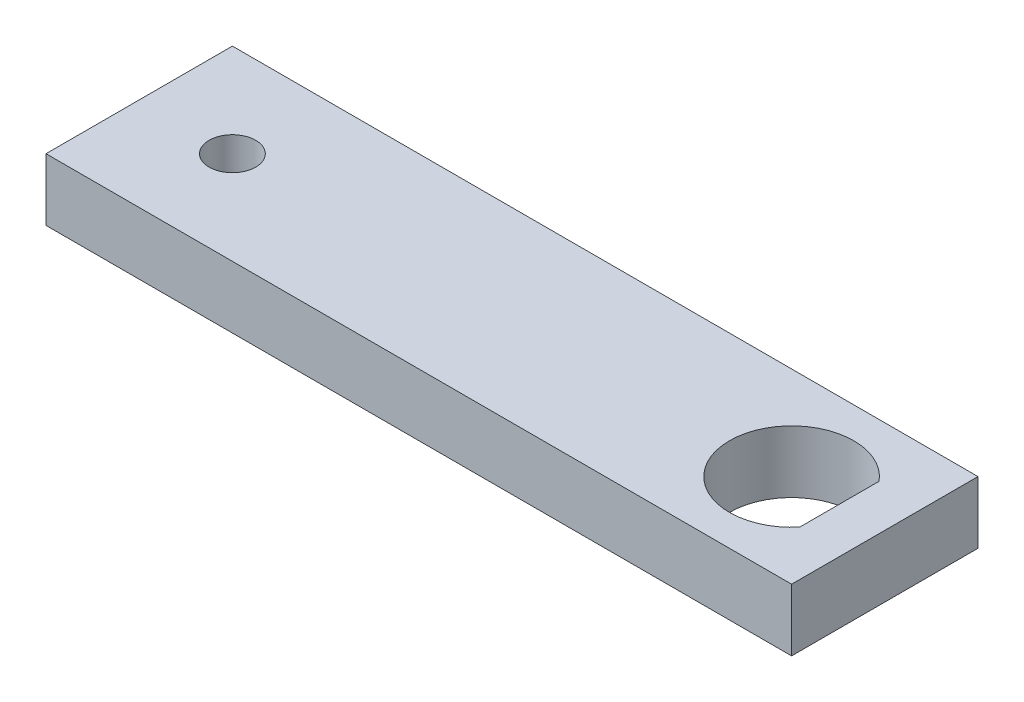
ISO-10303-21;
HEADER;
FILE_DESCRIPTION(('STEP AP214'),'2;1');
FILE_NAME('part.step','',(''),(''),'','','');
FILE_SCHEMA(('AUTOMOTIVE_DESIGN { 1 0 10303 214 1 1 1 1 }'));
ENDSEC;
DATA;
#1=APPLICATION_CONTEXT('core data for automotive mechanical design processes');
#2=APPLICATION_PROTOCOL_DEFINITION('international standard','automotive_design',2000,#1);
#3=PRODUCT_CONTEXT('',#1,'mechanical');
#4=PRODUCT('Part','Part','',(#3));
#5=PRODUCT_RELATED_PRODUCT_CATEGORY('part','',(#4));
#6=PRODUCT_DEFINITION_FORMATION('','',#4);
#7=PRODUCT_DEFINITION_CONTEXT('part definition',#1,'design');
#8=PRODUCT_DEFINITION('design','',#6,#7);
#9=PRODUCT_DEFINITION_SHAPE('','',#8);
#10=(LENGTH_UNIT() NAMED_UNIT(*) SI_UNIT(.MILLI.,.METRE.));
#11=(NAMED_UNIT(*) PLANE_ANGLE_UNIT() SI_UNIT($,.RADIAN.));
#12=(NAMED_UNIT(*) SI_UNIT($,.STERADIAN.) SOLID_ANGLE_UNIT());
#13=UNCERTAINTY_MEASURE_WITH_UNIT(LENGTH_MEASURE(1.E-05),#10,'distance_accuracy_value','');
#14=(GEOMETRIC_REPRESENTATION_CONTEXT(3) GLOBAL_UNCERTAINTY_ASSIGNED_CONTEXT((#13)) GLOBAL_UNIT_ASSIGNED_CONTEXT((#10,
#11,#12)) REPRESENTATION_CONTEXT('',''));
#15=CARTESIAN_POINT('',(0.,0.,0.));
#16=DIRECTION('',(0.,0.,1.));
#17=DIRECTION('',(1.,0.,0.));
#18=AXIS2_PLACEMENT_3D('',#15,#16,#17);
#19=CARTESIAN_POINT('',(0.,0.,19.05));
#20=DIRECTION('',(-1.,0.,0.));
#21=DIRECTION('',(0.,0.,1.));
#22=AXIS2_PLACEMENT_3D('',#19,#20,#21);
#23=PLANE('',#22);
#24=DIRECTION('',(0.,1.,0.));
#25=VECTOR('',#24,1.);
#26=CARTESIAN_POINT('',(0.,0.,0.));
#27=LINE('',#26,#25);
#28=CARTESIAN_POINT('',(0.,0.,0.));
#29=VERTEX_POINT('',#28);
#30=CARTESIAN_POINT('',(0.,6.35000000000001,0.));
#31=VERTEX_POINT('',#30);
#32=EDGE_CURVE('E112',#29,#31,#27,.T.);
#33=ORIENTED_EDGE('',*,*,#32,.F.);
#34=DIRECTION('',(0.,0.,-1.));
#35=VECTOR('',#34,1.);
#36=CARTESIAN_POINT('',(0.,0.,19.05));
#37=LINE('',#36,#35);
#38=CARTESIAN_POINT('',(0.,0.,19.05));
#39=VERTEX_POINT('',#38);
#40=EDGE_CURVE('E11',#39,#29,#37,.T.);
#41=ORIENTED_EDGE('',*,*,#40,.F.);
#42=DIRECTION('',(0.,1.,0.));
#43=VECTOR('',#42,1.);
#44=CARTESIAN_POINT('',(0.,0.,19.05));
#45=LINE('',#44,#43);
#46=CARTESIAN_POINT('',(0.,6.35000000000001,19.05));
#47=VERTEX_POINT('',#46);
#48=EDGE_CURVE('E114',#39,#47,#45,.T.);
#49=ORIENTED_EDGE('',*,*,#48,.T.);
#50=DIRECTION('',(0.,0.,-1.));
#51=VECTOR('',#50,1.);
#52=CARTESIAN_POINT('',(0.,6.35000000000001,19.05));
#53=LINE('',#52,#51);
#54=EDGE_CURVE('E42',#47,#31,#53,.T.);
#55=ORIENTED_EDGE('',*,*,#54,.T.);
#56=EDGE_LOOP('',(#33,#41,#49,#55));
#57=FACE_BOUND('',#56,.T.);
#58=ADVANCED_FACE('F39',(#57),#23,.T.);
#59=CARTESIAN_POINT('',(0.,0.,19.05));
#60=DIRECTION('',(0.,1.,0.));
#61=DIRECTION('',(-1.,0.,0.));
#62=AXIS2_PLACEMENT_3D('',#59,#60,#61);
#63=PLANE('',#62);
#64=CARTESIAN_POINT('',(9.525,0.,9.525));
#65=DIRECTION('',(0.,1.,0.));
#66=DIRECTION('',(-1.,0.,0.));
#67=AXIS2_PLACEMENT_3D('',#64,#65,#66);
#68=CIRCLE('',#67,2.38125);
#69=CARTESIAN_POINT('',(7.14375,0.,9.525));
#70=VERTEX_POINT('',#69);
#71=EDGE_CURVE('E110',#70,#70,#68,.T.);
#72=ORIENTED_EDGE('',*,*,#71,.T.);
#73=EDGE_LOOP('',(#72));
#74=FACE_BOUND('',#73,.T.);
#75=DIRECTION('',(0.,0.,1.));
#76=VECTOR('',#75,1.);
#77=CARTESIAN_POINT('',(71.5645,0.,5.47342132619889));
#78=LINE('',#77,#76);
#79=CARTESIAN_POINT('',(71.5645,0.,5.47342132619889));
#80=VERTEX_POINT('',#79);
#81=CARTESIAN_POINT('',(71.5645,0.,13.5765786738011));
#82=VERTEX_POINT('',#81);
#83=EDGE_CURVE('E91',#80,#82,#78,.T.);
#84=ORIENTED_EDGE('',*,*,#83,.F.);
#85=CARTESIAN_POINT('',(66.675,0.,9.525));
#86=DIRECTION('',(0.,1.,0.));
#87=DIRECTION('',(-1.,0.,0.));
#88=AXIS2_PLACEMENT_3D('',#85,#86,#87);
#89=CIRCLE('',#88,6.35);
#90=EDGE_CURVE('E55',#80,#82,#89,.T.);
#91=ORIENTED_EDGE('',*,*,#90,.T.);
#92=EDGE_LOOP('',(#84,#91));
#93=FACE_BOUND('',#92,.T.);
#94=DIRECTION('',(1.,0.,0.));
#95=VECTOR('',#94,1.);
#96=CARTESIAN_POINT('',(0.,0.,0.));
#97=LINE('',#96,#95);
#98=CARTESIAN_POINT('',(76.2,0.,0.));
#99=VERTEX_POINT('',#98);
#100=EDGE_CURVE('E118',#29,#99,#97,.T.);
#101=ORIENTED_EDGE('',*,*,#100,.T.);
#102=DIRECTION('',(0.,0.,-1.));
#103=VECTOR('',#102,1.);
#104=CARTESIAN_POINT('',(76.2,0.,19.05));
#105=LINE('',#104,#103);
#106=CARTESIAN_POINT('',(76.2,0.,19.05));
#107=VERTEX_POINT('',#106);
#108=EDGE_CURVE('E47',#107,#99,#105,.T.);
#109=ORIENTED_EDGE('',*,*,#108,.F.);
#110=DIRECTION('',(1.,0.,0.));
#111=VECTOR('',#110,1.);
#112=CARTESIAN_POINT('',(0.,0.,19.05));
#113=LINE('',#112,#111);
#114=EDGE_CURVE('E123',#39,#107,#113,.T.);
#115=ORIENTED_EDGE('',*,*,#114,.F.);
#116=ORIENTED_EDGE('',*,*,#40,.T.);
#117=EDGE_LOOP('',(#101,#109,#115,#116));
#118=FACE_BOUND('',#117,.T.);
#119=ADVANCED_FACE('F101',(#74,#93,#118),#63,.F.);
#120=CARTESIAN_POINT('',(76.2,6.35,19.05));
#121=DIRECTION('',(1.,0.,0.));
#122=DIRECTION('',(0.,0.,-1.));
#123=AXIS2_PLACEMENT_3D('',#120,#121,#122);
#124=PLANE('',#123);
#125=DIRECTION('',(0.,-1.,0.));
#126=VECTOR('',#125,1.);
#127=CARTESIAN_POINT('',(76.2,6.35,0.));
#128=LINE('',#127,#126);
#129=CARTESIAN_POINT('',(76.2,6.35,0.));
#130=VERTEX_POINT('',#129);
#131=EDGE_CURVE('E130',#130,#99,#128,.T.);
#132=ORIENTED_EDGE('',*,*,#131,.F.);
#133=DIRECTION('',(0.,0.,-1.));
#134=VECTOR('',#133,1.);
#135=CARTESIAN_POINT('',(76.2,6.35,19.05));
#136=LINE('',#135,#134);
#137=CARTESIAN_POINT('',(76.2,6.35,19.05));
#138=VERTEX_POINT('',#137);
#139=EDGE_CURVE('E136',#138,#130,#136,.T.);
#140=ORIENTED_EDGE('',*,*,#139,.F.);
#141=DIRECTION('',(0.,-1.,0.));
#142=VECTOR('',#141,1.);
#143=CARTESIAN_POINT('',(76.2,6.35,19.05));
#144=LINE('',#143,#142);
#145=EDGE_CURVE('E120',#138,#107,#144,.T.);
#146=ORIENTED_EDGE('',*,*,#145,.T.);
#147=ORIENTED_EDGE('',*,*,#108,.T.);
#148=EDGE_LOOP('',(#132,#140,#146,#147));
#149=FACE_BOUND('',#148,.T.);
#150=ADVANCED_FACE('F155',(#149),#124,.T.);
#151=CARTESIAN_POINT('',(76.2,6.35,19.05));
#152=DIRECTION('',(0.,-1.,0.));
#153=DIRECTION('',(1.,0.,0.));
#154=AXIS2_PLACEMENT_3D('',#151,#152,#153);
#155=PLANE('',#154);
#156=CARTESIAN_POINT('',(9.525,6.35000000000001,9.525));
#157=DIRECTION('',(0.,1.,0.));
#158=DIRECTION('',(-1.,0.,0.));
#159=AXIS2_PLACEMENT_3D('',#156,#157,#158);
#160=CIRCLE('',#159,2.38125);
#161=CARTESIAN_POINT('',(7.14375,6.35000000000001,9.525));
#162=VERTEX_POINT('',#161);
#163=EDGE_CURVE('E107',#162,#162,#160,.T.);
#164=ORIENTED_EDGE('',*,*,#163,.F.);
#165=EDGE_LOOP('',(#164));
#166=FACE_BOUND('',#165,.T.);
#167=DIRECTION('',(0.,0.,1.));
#168=VECTOR('',#167,1.);
#169=CARTESIAN_POINT('',(71.5645,6.35,5.47342132619889));
#170=LINE('',#169,#168);
#171=CARTESIAN_POINT('',(71.5645,6.35,5.47342132619889));
#172=VERTEX_POINT('',#171);
#173=CARTESIAN_POINT('',(71.5645,6.35,13.5765786738011));
#174=VERTEX_POINT('',#173);
#175=EDGE_CURVE('E103',#172,#174,#170,.T.);
#176=ORIENTED_EDGE('',*,*,#175,.T.);
#177=CARTESIAN_POINT('',(66.675,6.35,9.525));
#178=DIRECTION('',(0.,1.,0.));
#179=DIRECTION('',(-1.,0.,0.));
#180=AXIS2_PLACEMENT_3D('',#177,#178,#179);
#181=CIRCLE('',#180,6.35);
#182=EDGE_CURVE('E60',#172,#174,#181,.T.);
#183=ORIENTED_EDGE('',*,*,#182,.F.);
#184=EDGE_LOOP('',(#176,#183));
#185=FACE_BOUND('',#184,.T.);
#186=DIRECTION('',(-1.,0.,0.));
#187=VECTOR('',#186,1.);
#188=CARTESIAN_POINT('',(76.2,6.35,0.));
#189=LINE('',#188,#187);
#190=EDGE_CURVE('E127',#130,#31,#189,.T.);
#191=ORIENTED_EDGE('',*,*,#190,.T.);
#192=ORIENTED_EDGE('',*,*,#54,.F.);
#193=DIRECTION('',(-1.,0.,0.));
#194=VECTOR('',#193,1.);
#195=CARTESIAN_POINT('',(76.2,6.35,19.05));
#196=LINE('',#195,#194);
#197=EDGE_CURVE('E117',#138,#47,#196,.T.);
#198=ORIENTED_EDGE('',*,*,#197,.F.);
#199=ORIENTED_EDGE('',*,*,#139,.T.);
#200=EDGE_LOOP('',(#191,#192,#198,#199));
#201=FACE_BOUND('',#200,.T.);
#202=ADVANCED_FACE('F144',(#166,#185,#201),#155,.F.);
#203=CARTESIAN_POINT('',(0.,0.,19.05));
#204=DIRECTION('',(0.,0.,-1.));
#205=DIRECTION('',(-1.,0.,0.));
#206=AXIS2_PLACEMENT_3D('',#203,#204,#205);
#207=PLANE('',#206);
#208=ORIENTED_EDGE('',*,*,#48,.F.);
#209=ORIENTED_EDGE('',*,*,#114,.T.);
#210=ORIENTED_EDGE('',*,*,#145,.F.);
#211=ORIENTED_EDGE('',*,*,#197,.T.);
#212=EDGE_LOOP('',(#208,#209,#210,#211));
#213=FACE_BOUND('',#212,.T.);
#214=ADVANCED_FACE('F153',(#213),#207,.F.);
#215=CARTESIAN_POINT('',(0.,0.,0.));
#216=DIRECTION('',(0.,0.,-1.));
#217=DIRECTION('',(-1.,0.,0.));
#218=AXIS2_PLACEMENT_3D('',#215,#216,#217);
#219=PLANE('',#218);
#220=ORIENTED_EDGE('',*,*,#32,.T.);
#221=ORIENTED_EDGE('',*,*,#190,.F.);
#222=ORIENTED_EDGE('',*,*,#131,.T.);
#223=ORIENTED_EDGE('',*,*,#100,.F.);
#224=EDGE_LOOP('',(#220,#221,#222,#223));
#225=FACE_BOUND('',#224,.T.);
#226=ADVANCED_FACE('F148',(#225),#219,.T.);
#227=CARTESIAN_POINT('',(66.675,0.,9.525));
#228=DIRECTION('',(0.,1.,0.));
#229=DIRECTION('',(-1.,0.,0.));
#230=AXIS2_PLACEMENT_3D('',#227,#228,#229);
#231=CYLINDRICAL_SURFACE('',#230,6.35);
#232=ORIENTED_EDGE('',*,*,#182,.T.);
#233=DIRECTION('',(0.,1.,0.));
#234=VECTOR('',#233,1.);
#235=CARTESIAN_POINT('',(71.5645,0.,13.5765786738011));
#236=LINE('',#235,#234);
#237=EDGE_CURVE('E94',#82,#174,#236,.T.);
#238=ORIENTED_EDGE('',*,*,#237,.F.);
#239=ORIENTED_EDGE('',*,*,#90,.F.);
#240=DIRECTION('',(0.,1.,0.));
#241=VECTOR('',#240,1.);
#242=CARTESIAN_POINT('',(71.5645,0.,5.47342132619889));
#243=LINE('',#242,#241);
#244=EDGE_CURVE('E96',#80,#172,#243,.T.);
#245=ORIENTED_EDGE('',*,*,#244,.T.);
#246=EDGE_LOOP('',(#232,#238,#239,#245));
#247=FACE_BOUND('',#246,.T.);
#248=ADVANCED_FACE('F99',(#247),#231,.F.);
#249=CARTESIAN_POINT('',(71.5645,0.,5.47342132619889));
#250=DIRECTION('',(-1.,0.,0.));
#251=DIRECTION('',(0.,-1.,0.));
#252=AXIS2_PLACEMENT_3D('',#249,#250,#251);
#253=PLANE('',#252);
#254=ORIENTED_EDGE('',*,*,#175,.F.);
#255=ORIENTED_EDGE('',*,*,#244,.F.);
#256=ORIENTED_EDGE('',*,*,#83,.T.);
#257=ORIENTED_EDGE('',*,*,#237,.T.);
#258=EDGE_LOOP('',(#254,#255,#256,#257));
#259=FACE_BOUND('',#258,.T.);
#260=ADVANCED_FACE('F93',(#259),#253,.T.);
#261=CARTESIAN_POINT('',(9.525,0.,9.525));
#262=DIRECTION('',(0.,1.,0.));
#263=DIRECTION('',(-1.,0.,0.));
#264=AXIS2_PLACEMENT_3D('',#261,#262,#263);
#265=CYLINDRICAL_SURFACE('',#264,2.38125);
#266=CARTESIAN_POINT('',(7.14375,0.,9.525));
#267=CARTESIAN_POINT('',(7.14375,0.0661458333333243,9.525));
#268=CARTESIAN_POINT('',(7.14375,0.132291666666658,9.525));
#269=CARTESIAN_POINT('',(7.14375,0.264583333333325,9.525));
#270=CARTESIAN_POINT('',(7.14375,0.330729166666659,9.525));
#271=CARTESIAN_POINT('',(7.14375,0.463020833333326,9.525));
#272=CARTESIAN_POINT('',(7.14375,0.529166666666659,9.525));
#273=CARTESIAN_POINT('',(7.14375,0.661458333333326,9.525));
#274=CARTESIAN_POINT('',(7.14375,0.72760416666666,9.525));
#275=CARTESIAN_POINT('',(7.14375,0.859895833333327,9.525));
#276=CARTESIAN_POINT('',(7.14375,0.926041666666661,9.525));
#277=CARTESIAN_POINT('',(7.14375,1.05833333333333,9.525));
#278=CARTESIAN_POINT('',(7.14375,1.12447916666666,9.525));
#279=CARTESIAN_POINT('',(7.14375,1.25677083333333,9.525));
#280=CARTESIAN_POINT('',(7.14375,1.32291666666666,9.525));
#281=CARTESIAN_POINT('',(7.14375,1.45520833333333,9.525));
#282=CARTESIAN_POINT('',(7.14375,1.52135416666666,9.525));
#283=CARTESIAN_POINT('',(7.14375,1.65364583333333,9.525));
#284=CARTESIAN_POINT('',(7.14375,1.71979166666666,9.525));
#285=CARTESIAN_POINT('',(7.14375,1.85208333333333,9.525));
#286=CARTESIAN_POINT('',(7.14375,1.91822916666666,9.525));
#287=CARTESIAN_POINT('',(7.14375,2.05052083333333,9.525));
#288=CARTESIAN_POINT('',(7.14375,2.11666666666666,9.525));
#289=CARTESIAN_POINT('',(7.14375,2.24895833333333,9.525));
#290=CARTESIAN_POINT('',(7.14375,2.31510416666667,9.525));
#291=CARTESIAN_POINT('',(7.14375,2.44739583333333,9.525));
#292=CARTESIAN_POINT('',(7.14375,2.51354166666667,9.525));
#293=CARTESIAN_POINT('',(7.14375,2.64583333333333,9.525));
#294=CARTESIAN_POINT('',(7.14375,2.71197916666667,9.525));
#295=CARTESIAN_POINT('',(7.14375,2.84427083333333,9.525));
#296=CARTESIAN_POINT('',(7.14375,2.91041666666667,9.525));
#297=CARTESIAN_POINT('',(7.14375,3.04270833333334,9.525));
#298=CARTESIAN_POINT('',(7.14375,3.10885416666667,9.525));
#299=CARTESIAN_POINT('',(7.14375,3.24114583333334,9.525));
#300=CARTESIAN_POINT('',(7.14375,3.30729166666667,9.525));
#301=CARTESIAN_POINT('',(7.14375,3.43958333333334,9.525));
#302=CARTESIAN_POINT('',(7.14375,3.50572916666667,9.525));
#303=CARTESIAN_POINT('',(7.14375,3.63802083333334,9.525));
#304=CARTESIAN_POINT('',(7.14375,3.70416666666667,9.525));
#305=CARTESIAN_POINT('',(7.14375,3.83645833333334,9.525));
#306=CARTESIAN_POINT('',(7.14375,3.90260416666667,9.525));
#307=CARTESIAN_POINT('',(7.14375,4.03489583333334,9.525));
#308=CARTESIAN_POINT('',(7.14375,4.10104166666667,9.525));
#309=CARTESIAN_POINT('',(7.14375,4.23333333333334,9.525));
#310=CARTESIAN_POINT('',(7.14375,4.29947916666667,9.525));
#311=CARTESIAN_POINT('',(7.14375,4.43177083333334,9.525));
#312=CARTESIAN_POINT('',(7.14375,4.49791666666667,9.525));
#313=CARTESIAN_POINT('',(7.14375,4.63020833333334,9.525));
#314=CARTESIAN_POINT('',(7.14375,4.69635416666667,9.525));
#315=CARTESIAN_POINT('',(7.14375,4.82864583333334,9.525));
#316=CARTESIAN_POINT('',(7.14375,4.89479166666668,9.525));
#317=CARTESIAN_POINT('',(7.14375,5.02708333333334,9.525));
#318=CARTESIAN_POINT('',(7.14375,5.09322916666668,9.525));
#319=CARTESIAN_POINT('',(7.14375,5.22552083333334,9.525));
#320=CARTESIAN_POINT('',(7.14375,5.29166666666668,9.525));
#321=CARTESIAN_POINT('',(7.14375,5.42395833333334,9.525));
#322=CARTESIAN_POINT('',(7.14375,5.49010416666668,9.525));
#323=CARTESIAN_POINT('',(7.14375,5.62239583333334,9.525));
#324=CARTESIAN_POINT('',(7.14375,5.68854166666668,9.525));
#325=CARTESIAN_POINT('',(7.14375,5.82083333333335,9.525));
#326=CARTESIAN_POINT('',(7.14375,5.88697916666668,9.525));
#327=CARTESIAN_POINT('',(7.14375,6.01927083333335,9.525));
#328=CARTESIAN_POINT('',(7.14375,6.08541666666668,9.525));
#329=CARTESIAN_POINT('',(7.14375,6.21770833333335,9.525));
#330=CARTESIAN_POINT('',(7.14375,6.28385416666668,9.525));
#331=CARTESIAN_POINT('',(7.14375,6.35000000000001,9.525));
#332=B_SPLINE_CURVE_WITH_KNOTS('',3,(#266,#267,#268,#269,#270,#271,#272,#273,#274,#275,#276,
#277,#278,#279,#280,#281,#282,#283,#284,#285,#286,#287,#288,#289,#290,#291,#292,#293,#294,#295,
#296,#297,#298,#299,#300,#301,#302,#303,#304,#305,#306,#307,#308,#309,#310,#311,#312,#313,#314,
#315,#316,#317,#318,#319,#320,#321,#322,#323,#324,#325,#326,#327,#328,#329,#330,#331),
.UNSPECIFIED.,.F.,.F.,(4,2,2,2,2,2,2,2,2,2,2,2,2,2,2,2,2,2,2,2,2,2,2,2,2,2,2,2,2,2,2,2,4),(0.,
0.198437500000001,0.396875000000001,0.595312500000002,0.793750000000003,0.992187500000003,
1.190625,1.38906250000001,1.58750000000001,1.78593750000001,1.98437500000001,2.18281250000001,
2.38125000000001,2.57968750000001,2.77812500000001,2.97656250000001,3.17500000000001,
3.37343750000001,3.57187500000001,3.77031250000001,3.96875000000001,4.16718750000001,
4.36562500000002,4.56406250000002,4.76250000000002,4.96093750000002,5.15937500000002,
5.35781250000002,5.55625000000002,5.75468750000002,5.95312500000002,6.15156250000002,
6.35000000000002),.UNSPECIFIED.);
#333=EDGE_CURVE('BSEAM194',#70,#162,#332,.T.);
#334=ORIENTED_EDGE('',*,*,#71,.F.);
#335=ORIENTED_EDGE('',*,*,#163,.T.);
#336=ORIENTED_EDGE('',*,*,#333,.T.);
#337=ORIENTED_EDGE('',*,*,#333,.F.);
#338=EDGE_LOOP('',(#334,#336,#335,#337));
#339=FACE_BOUND('',#338,.T.);
#340=ADVANCED_FACE('F194',(#339),#265,.F.);
#341=CLOSED_SHELL('',(#58,#119,#150,#202,#214,#226,#248,#260,#340));
#342=MANIFOLD_SOLID_BREP('B2',#341);
#343=ADVANCED_BREP_SHAPE_REPRESENTATION('',(#18,#342),#14);
#344=SHAPE_DEFINITION_REPRESENTATION(#9,#343);
ENDSEC;
END-ISO-10303-21;
